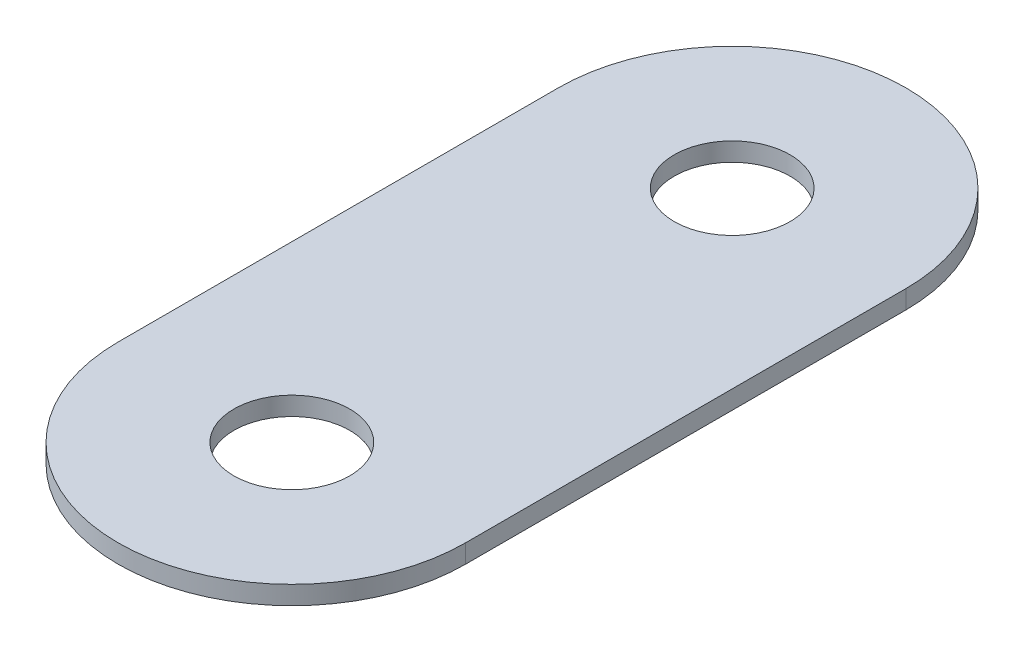
ISO-10303-21;
HEADER;
FILE_DESCRIPTION(('STEP AP214'),'2;1');
FILE_NAME('part.step','',(''),(''),'','','');
FILE_SCHEMA(('AUTOMOTIVE_DESIGN { 1 0 10303 214 1 1 1 1 }'));
ENDSEC;
DATA;
#1=APPLICATION_CONTEXT('core data for automotive mechanical design processes');
#2=APPLICATION_PROTOCOL_DEFINITION('international standard','automotive_design',2000,#1);
#3=PRODUCT_CONTEXT('',#1,'mechanical');
#4=PRODUCT('Part','Part','',(#3));
#5=PRODUCT_RELATED_PRODUCT_CATEGORY('part','',(#4));
#6=PRODUCT_DEFINITION_FORMATION('','',#4);
#7=PRODUCT_DEFINITION_CONTEXT('part definition',#1,'design');
#8=PRODUCT_DEFINITION('design','',#6,#7);
#9=PRODUCT_DEFINITION_SHAPE('','',#8);
#10=(LENGTH_UNIT() NAMED_UNIT(*) SI_UNIT(.MILLI.,.METRE.));
#11=(NAMED_UNIT(*) PLANE_ANGLE_UNIT() SI_UNIT($,.RADIAN.));
#12=(NAMED_UNIT(*) SI_UNIT($,.STERADIAN.) SOLID_ANGLE_UNIT());
#13=UNCERTAINTY_MEASURE_WITH_UNIT(LENGTH_MEASURE(1.E-05),#10,'distance_accuracy_value','');
#14=(GEOMETRIC_REPRESENTATION_CONTEXT(3) GLOBAL_UNCERTAINTY_ASSIGNED_CONTEXT((#13)) GLOBAL_UNIT_ASSIGNED_CONTEXT((#10,
#11,#12)) REPRESENTATION_CONTEXT('',''));
#15=CARTESIAN_POINT('',(0.,0.,0.));
#16=DIRECTION('',(0.,0.,1.));
#17=DIRECTION('',(1.,0.,0.));
#18=AXIS2_PLACEMENT_3D('',#15,#16,#17);
#19=CARTESIAN_POINT('',(0.,0.8,-19.));
#20=DIRECTION('',(0.,-1.,0.));
#21=DIRECTION('',(0.,0.,-1.));
#22=AXIS2_PLACEMENT_3D('',#19,#20,#21);
#23=CYLINDRICAL_SURFACE('',#22,15.);
#24=CARTESIAN_POINT('',(0.,-0.8,-19.));
#25=DIRECTION('',(0.,1.,0.));
#26=DIRECTION('',(0.,0.,1.));
#27=AXIS2_PLACEMENT_3D('',#24,#25,#26);
#28=CIRCLE('',#27,15.);
#29=CARTESIAN_POINT('',(15.,-0.8,-19.));
#30=VERTEX_POINT('',#29);
#31=CARTESIAN_POINT('',(-15.,-0.8,-19.));
#32=VERTEX_POINT('',#31);
#33=EDGE_CURVE('E126',#30,#32,#28,.T.);
#34=ORIENTED_EDGE('',*,*,#33,.T.);
#35=DIRECTION('',(0.,-1.,0.));
#36=VECTOR('',#35,1.);
#37=CARTESIAN_POINT('',(-15.,0.8,-19.));
#38=LINE('',#37,#36);
#39=CARTESIAN_POINT('',(-15.,0.8,-19.));
#40=VERTEX_POINT('',#39);
#41=EDGE_CURVE('E13',#40,#32,#38,.T.);
#42=ORIENTED_EDGE('',*,*,#41,.F.);
#43=CARTESIAN_POINT('',(0.,0.8,-19.));
#44=DIRECTION('',(0.,1.,0.));
#45=DIRECTION('',(0.,0.,1.));
#46=AXIS2_PLACEMENT_3D('',#43,#44,#45);
#47=CIRCLE('',#46,15.);
#48=CARTESIAN_POINT('',(15.,0.8,-19.));
#49=VERTEX_POINT('',#48);
#50=EDGE_CURVE('E109',#49,#40,#47,.T.);
#51=ORIENTED_EDGE('',*,*,#50,.F.);
#52=DIRECTION('',(0.,-1.,0.));
#53=VECTOR('',#52,1.);
#54=CARTESIAN_POINT('',(15.,0.8,-19.));
#55=LINE('',#54,#53);
#56=EDGE_CURVE('E122',#49,#30,#55,.T.);
#57=ORIENTED_EDGE('',*,*,#56,.T.);
#58=EDGE_LOOP('',(#34,#42,#51,#57));
#59=FACE_BOUND('',#58,.T.);
#60=ADVANCED_FACE('F57',(#59),#23,.T.);
#61=CARTESIAN_POINT('',(-15.,0.8,-19.));
#62=DIRECTION('',(1.,0.,0.));
#63=DIRECTION('',(0.,0.,-1.));
#64=AXIS2_PLACEMENT_3D('',#61,#62,#63);
#65=PLANE('',#64);
#66=DIRECTION('',(0.,0.,1.));
#67=VECTOR('',#66,1.);
#68=CARTESIAN_POINT('',(-15.,-0.8,-19.));
#69=LINE('',#68,#67);
#70=CARTESIAN_POINT('',(-15.,-0.8,19.));
#71=VERTEX_POINT('',#70);
#72=EDGE_CURVE('E114',#32,#71,#69,.T.);
#73=ORIENTED_EDGE('',*,*,#72,.T.);
#74=DIRECTION('',(0.,-1.,0.));
#75=VECTOR('',#74,1.);
#76=CARTESIAN_POINT('',(-15.,0.8,19.));
#77=LINE('',#76,#75);
#78=CARTESIAN_POINT('',(-15.,0.8,19.));
#79=VERTEX_POINT('',#78);
#80=EDGE_CURVE('E66',#79,#71,#77,.T.);
#81=ORIENTED_EDGE('',*,*,#80,.F.);
#82=DIRECTION('',(0.,0.,1.));
#83=VECTOR('',#82,1.);
#84=CARTESIAN_POINT('',(-15.,0.8,-19.));
#85=LINE('',#84,#83);
#86=EDGE_CURVE('E104',#40,#79,#85,.T.);
#87=ORIENTED_EDGE('',*,*,#86,.F.);
#88=ORIENTED_EDGE('',*,*,#41,.T.);
#89=EDGE_LOOP('',(#73,#81,#87,#88));
#90=FACE_BOUND('',#89,.T.);
#91=ADVANCED_FACE('F113',(#90),#65,.F.);
#92=CARTESIAN_POINT('',(0.,0.8,19.));
#93=DIRECTION('',(0.,-1.,0.));
#94=DIRECTION('',(0.,0.,-1.));
#95=AXIS2_PLACEMENT_3D('',#92,#93,#94);
#96=CYLINDRICAL_SURFACE('',#95,15.);
#97=CARTESIAN_POINT('',(0.,-0.8,19.));
#98=DIRECTION('',(0.,1.,0.));
#99=DIRECTION('',(0.,0.,1.));
#100=AXIS2_PLACEMENT_3D('',#97,#98,#99);
#101=CIRCLE('',#100,15.);
#102=CARTESIAN_POINT('',(15.,-0.8,19.));
#103=VERTEX_POINT('',#102);
#104=EDGE_CURVE('E91',#71,#103,#101,.T.);
#105=ORIENTED_EDGE('',*,*,#104,.T.);
#106=DIRECTION('',(0.,-1.,0.));
#107=VECTOR('',#106,1.);
#108=CARTESIAN_POINT('',(15.,0.8,19.));
#109=LINE('',#108,#107);
#110=CARTESIAN_POINT('',(15.,0.8,19.));
#111=VERTEX_POINT('',#110);
#112=EDGE_CURVE('E116',#111,#103,#109,.T.);
#113=ORIENTED_EDGE('',*,*,#112,.F.);
#114=CARTESIAN_POINT('',(0.,0.8,19.));
#115=DIRECTION('',(0.,1.,0.));
#116=DIRECTION('',(0.,0.,1.));
#117=AXIS2_PLACEMENT_3D('',#114,#115,#116);
#118=CIRCLE('',#117,15.);
#119=EDGE_CURVE('E107',#79,#111,#118,.T.);
#120=ORIENTED_EDGE('',*,*,#119,.F.);
#121=ORIENTED_EDGE('',*,*,#80,.T.);
#122=EDGE_LOOP('',(#105,#113,#120,#121));
#123=FACE_BOUND('',#122,.T.);
#124=ADVANCED_FACE('F117',(#123),#96,.T.);
#125=CARTESIAN_POINT('',(15.,0.8,-19.));
#126=DIRECTION('',(-1.,0.,0.));
#127=DIRECTION('',(0.,0.,1.));
#128=AXIS2_PLACEMENT_3D('',#125,#126,#127);
#129=PLANE('',#128);
#130=DIRECTION('',(0.,0.,-1.));
#131=VECTOR('',#130,1.);
#132=CARTESIAN_POINT('',(15.,-0.8,-19.));
#133=LINE('',#132,#131);
#134=EDGE_CURVE('E97',#103,#30,#133,.T.);
#135=ORIENTED_EDGE('',*,*,#134,.T.);
#136=ORIENTED_EDGE('',*,*,#56,.F.);
#137=DIRECTION('',(0.,0.,-1.));
#138=VECTOR('',#137,1.);
#139=CARTESIAN_POINT('',(15.,0.8,-19.));
#140=LINE('',#139,#138);
#141=EDGE_CURVE('E74',#111,#49,#140,.T.);
#142=ORIENTED_EDGE('',*,*,#141,.F.);
#143=ORIENTED_EDGE('',*,*,#112,.T.);
#144=EDGE_LOOP('',(#135,#136,#142,#143));
#145=FACE_BOUND('',#144,.T.);
#146=ADVANCED_FACE('F141',(#145),#129,.F.);
#147=CARTESIAN_POINT('',(0.,0.8,-19.));
#148=DIRECTION('',(0.,1.,0.));
#149=DIRECTION('',(0.,0.,1.));
#150=AXIS2_PLACEMENT_3D('',#147,#148,#149);
#151=PLANE('',#150);
#152=CARTESIAN_POINT('',(0.,0.8,-19.));
#153=DIRECTION('',(0.,1.,0.));
#154=DIRECTION('',(0.,0.,1.));
#155=AXIS2_PLACEMENT_3D('',#152,#153,#154);
#156=CIRCLE('',#155,5.);
#157=CARTESIAN_POINT('',(0.,0.8,-14.));
#158=VERTEX_POINT('',#157);
#159=EDGE_CURVE('E153',#158,#158,#156,.T.);
#160=ORIENTED_EDGE('',*,*,#159,.F.);
#161=EDGE_LOOP('',(#160));
#162=FACE_BOUND('',#161,.T.);
#163=CARTESIAN_POINT('',(0.,0.8,19.));
#164=DIRECTION('',(0.,1.,0.));
#165=DIRECTION('',(0.,0.,1.));
#166=AXIS2_PLACEMENT_3D('',#163,#164,#165);
#167=CIRCLE('',#166,5.);
#168=CARTESIAN_POINT('',(0.,0.8,24.));
#169=VERTEX_POINT('',#168);
#170=EDGE_CURVE('E149',#169,#169,#167,.T.);
#171=ORIENTED_EDGE('',*,*,#170,.F.);
#172=EDGE_LOOP('',(#171));
#173=FACE_BOUND('',#172,.T.);
#174=ORIENTED_EDGE('',*,*,#50,.T.);
#175=ORIENTED_EDGE('',*,*,#86,.T.);
#176=ORIENTED_EDGE('',*,*,#119,.T.);
#177=ORIENTED_EDGE('',*,*,#141,.T.);
#178=EDGE_LOOP('',(#174,#175,#176,#177));
#179=FACE_BOUND('',#178,.T.);
#180=ADVANCED_FACE('F105',(#162,#173,#179),#151,.T.);
#181=CARTESIAN_POINT('',(0.,-0.8,-19.));
#182=DIRECTION('',(0.,1.,0.));
#183=DIRECTION('',(0.,0.,1.));
#184=AXIS2_PLACEMENT_3D('',#181,#182,#183);
#185=PLANE('',#184);
#186=CARTESIAN_POINT('',(0.,-0.8,-19.));
#187=DIRECTION('',(0.,1.,0.));
#188=DIRECTION('',(0.,0.,1.));
#189=AXIS2_PLACEMENT_3D('',#186,#187,#188);
#190=CIRCLE('',#189,5.);
#191=CARTESIAN_POINT('',(0.,-0.8,-14.));
#192=VERTEX_POINT('',#191);
#193=EDGE_CURVE('E130',#192,#192,#190,.T.);
#194=ORIENTED_EDGE('',*,*,#193,.T.);
#195=EDGE_LOOP('',(#194));
#196=FACE_BOUND('',#195,.T.);
#197=CARTESIAN_POINT('',(0.,-0.8,19.));
#198=DIRECTION('',(0.,1.,0.));
#199=DIRECTION('',(0.,0.,1.));
#200=AXIS2_PLACEMENT_3D('',#197,#198,#199);
#201=CIRCLE('',#200,5.);
#202=CARTESIAN_POINT('',(0.,-0.8,24.));
#203=VERTEX_POINT('',#202);
#204=EDGE_CURVE('E154',#203,#203,#201,.T.);
#205=ORIENTED_EDGE('',*,*,#204,.T.);
#206=EDGE_LOOP('',(#205));
#207=FACE_BOUND('',#206,.T.);
#208=ORIENTED_EDGE('',*,*,#33,.F.);
#209=ORIENTED_EDGE('',*,*,#134,.F.);
#210=ORIENTED_EDGE('',*,*,#104,.F.);
#211=ORIENTED_EDGE('',*,*,#72,.F.);
#212=EDGE_LOOP('',(#208,#209,#210,#211));
#213=FACE_BOUND('',#212,.T.);
#214=ADVANCED_FACE('F144',(#196,#207,#213),#185,.F.);
#215=CARTESIAN_POINT('',(0.,-0.8,19.));
#216=DIRECTION('',(0.,1.,0.));
#217=DIRECTION('',(0.,0.,1.));
#218=AXIS2_PLACEMENT_3D('',#215,#216,#217);
#219=CYLINDRICAL_SURFACE('',#218,5.);
#220=ORIENTED_EDGE('',*,*,#204,.F.);
#221=EDGE_LOOP('',(#220));
#222=FACE_BOUND('',#221,.T.);
#223=ORIENTED_EDGE('',*,*,#170,.T.);
#224=EDGE_LOOP('',(#223));
#225=FACE_BOUND('',#224,.T.);
#226=ADVANCED_FACE('F173',(#222,#225),#219,.F.);
#227=CARTESIAN_POINT('',(0.,-0.8,-19.));
#228=DIRECTION('',(0.,1.,0.));
#229=DIRECTION('',(0.,0.,1.));
#230=AXIS2_PLACEMENT_3D('',#227,#228,#229);
#231=CYLINDRICAL_SURFACE('',#230,5.);
#232=ORIENTED_EDGE('',*,*,#193,.F.);
#233=EDGE_LOOP('',(#232));
#234=FACE_BOUND('',#233,.T.);
#235=ORIENTED_EDGE('',*,*,#159,.T.);
#236=EDGE_LOOP('',(#235));
#237=FACE_BOUND('',#236,.T.);
#238=ADVANCED_FACE('F166',(#234,#237),#231,.F.);
#239=CLOSED_SHELL('',(#60,#91,#124,#146,#180,#214,#226,#238));
#240=MANIFOLD_SOLID_BREP('B2',#239);
#241=ADVANCED_BREP_SHAPE_REPRESENTATION('',(#18,#240),#14);
#242=SHAPE_DEFINITION_REPRESENTATION(#9,#241);
ENDSEC;
END-ISO-10303-21;
